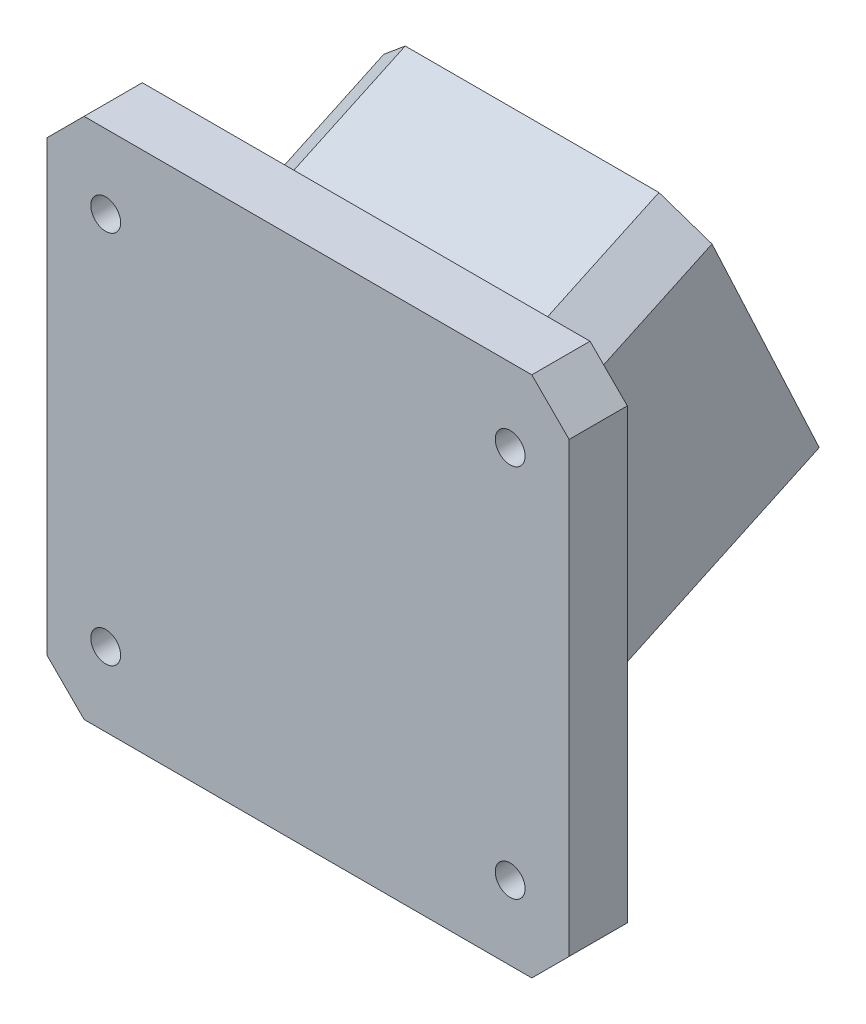
ISO-10303-21;
HEADER;
FILE_DESCRIPTION(('STEP AP214'),'2;1');
FILE_NAME('part.step','',(''),(''),'','','');
FILE_SCHEMA(('AUTOMOTIVE_DESIGN { 1 0 10303 214 1 1 1 1 }'));
ENDSEC;
DATA;
#1=APPLICATION_CONTEXT('core data for automotive mechanical design processes');
#2=APPLICATION_PROTOCOL_DEFINITION('international standard','automotive_design',2000,#1);
#3=PRODUCT_CONTEXT('',#1,'mechanical');
#4=PRODUCT('Part','Part','',(#3));
#5=PRODUCT_RELATED_PRODUCT_CATEGORY('part','',(#4));
#6=PRODUCT_DEFINITION_FORMATION('','',#4);
#7=PRODUCT_DEFINITION_CONTEXT('part definition',#1,'design');
#8=PRODUCT_DEFINITION('design','',#6,#7);
#9=PRODUCT_DEFINITION_SHAPE('','',#8);
#10=(LENGTH_UNIT() NAMED_UNIT(*) SI_UNIT(.MILLI.,.METRE.));
#11=(NAMED_UNIT(*) PLANE_ANGLE_UNIT() SI_UNIT($,.RADIAN.));
#12=(NAMED_UNIT(*) SI_UNIT($,.STERADIAN.) SOLID_ANGLE_UNIT());
#13=UNCERTAINTY_MEASURE_WITH_UNIT(LENGTH_MEASURE(1.E-05),#10,'distance_accuracy_value','');
#14=(GEOMETRIC_REPRESENTATION_CONTEXT(3) GLOBAL_UNCERTAINTY_ASSIGNED_CONTEXT((#13)) GLOBAL_UNIT_ASSIGNED_CONTEXT((#10,
#11,#12)) REPRESENTATION_CONTEXT('',''));
#15=CARTESIAN_POINT('',(0.,0.,0.));
#16=DIRECTION('',(0.,0.,1.));
#17=DIRECTION('',(1.,0.,0.));
#18=AXIS2_PLACEMENT_3D('',#15,#16,#17);
#19=CARTESIAN_POINT('',(0.,0.,3.9));
#20=DIRECTION('',(0.,0.,-1.));
#21=DIRECTION('',(-1.,0.,0.));
#22=AXIS2_PLACEMENT_3D('',#19,#20,#21);
#23=PLANE('',#22);
#24=DIRECTION('',(-1.,0.,0.));
#25=VECTOR('',#24,1.);
#26=CARTESIAN_POINT('',(15.,17.5,3.9));
#27=LINE('',#26,#25);
#28=CARTESIAN_POINT('',(15.,17.5,3.9));
#29=VERTEX_POINT('',#28);
#30=CARTESIAN_POINT('',(-15.,17.5,3.9));
#31=VERTEX_POINT('',#30);
#32=EDGE_CURVE('E177',#29,#31,#27,.T.);
#33=ORIENTED_EDGE('',*,*,#32,.T.);
#34=DIRECTION('',(-0.707106781186548,-0.707106781186548,0.));
#35=VECTOR('',#34,1.);
#36=CARTESIAN_POINT('',(-15.,17.5,3.9));
#37=LINE('',#36,#35);
#38=CARTESIAN_POINT('',(-17.5,15.,3.9));
#39=VERTEX_POINT('',#38);
#40=EDGE_CURVE('E106',#31,#39,#37,.T.);
#41=ORIENTED_EDGE('',*,*,#40,.T.);
#42=DIRECTION('',(0.,-1.,0.));
#43=VECTOR('',#42,1.);
#44=CARTESIAN_POINT('',(-17.5,-15.,3.9));
#45=LINE('',#44,#43);
#46=CARTESIAN_POINT('',(-17.5,-15.,3.9));
#47=VERTEX_POINT('',#46);
#48=EDGE_CURVE('E299',#39,#47,#45,.T.);
#49=ORIENTED_EDGE('',*,*,#48,.T.);
#50=DIRECTION('',(0.707106781186548,-0.707106781186548,0.));
#51=VECTOR('',#50,1.);
#52=CARTESIAN_POINT('',(-15.,-17.5,3.9));
#53=LINE('',#52,#51);
#54=CARTESIAN_POINT('',(-15.,-17.5,3.9));
#55=VERTEX_POINT('',#54);
#56=EDGE_CURVE('E302',#47,#55,#53,.T.);
#57=ORIENTED_EDGE('',*,*,#56,.T.);
#58=DIRECTION('',(1.,0.,0.));
#59=VECTOR('',#58,1.);
#60=CARTESIAN_POINT('',(15.,-17.5,3.9));
#61=LINE('',#60,#59);
#62=CARTESIAN_POINT('',(15.,-17.5,3.9));
#63=VERTEX_POINT('',#62);
#64=EDGE_CURVE('E128',#55,#63,#61,.T.);
#65=ORIENTED_EDGE('',*,*,#64,.T.);
#66=DIRECTION('',(0.707106781186548,0.707106781186548,0.));
#67=VECTOR('',#66,1.);
#68=CARTESIAN_POINT('',(15.,-17.5,3.9));
#69=LINE('',#68,#67);
#70=CARTESIAN_POINT('',(17.5,-15.,3.9));
#71=VERTEX_POINT('',#70);
#72=EDGE_CURVE('E121',#63,#71,#69,.T.);
#73=ORIENTED_EDGE('',*,*,#72,.T.);
#74=DIRECTION('',(0.,1.,0.));
#75=VECTOR('',#74,1.);
#76=CARTESIAN_POINT('',(17.5,-15.,3.9));
#77=LINE('',#76,#75);
#78=CARTESIAN_POINT('',(17.5,15.,3.9));
#79=VERTEX_POINT('',#78);
#80=EDGE_CURVE('E125',#71,#79,#77,.T.);
#81=ORIENTED_EDGE('',*,*,#80,.T.);
#82=DIRECTION('',(-0.707106781186548,0.707106781186548,0.));
#83=VECTOR('',#82,1.);
#84=CARTESIAN_POINT('',(17.5,15.,3.9));
#85=LINE('',#84,#83);
#86=EDGE_CURVE('E64',#79,#29,#85,.T.);
#87=ORIENTED_EDGE('',*,*,#86,.T.);
#88=EDGE_LOOP('',(#33,#41,#49,#57,#65,#73,#81,#87));
#89=FACE_BOUND('',#88,.T.);
#90=CARTESIAN_POINT('',(-13.55,12.55,3.9));
#91=DIRECTION('',(0.,0.,-1.));
#92=DIRECTION('',(-1.,0.,0.));
#93=AXIS2_PLACEMENT_3D('',#90,#91,#92);
#94=CIRCLE('',#93,1.);
#95=CARTESIAN_POINT('',(-14.55,12.55,3.9));
#96=VERTEX_POINT('',#95);
#97=EDGE_CURVE('E280',#96,#96,#94,.T.);
#98=ORIENTED_EDGE('',*,*,#97,.T.);
#99=EDGE_LOOP('',(#98));
#100=FACE_BOUND('',#99,.T.);
#101=CARTESIAN_POINT('',(13.55,-12.55,3.9));
#102=DIRECTION('',(0.,0.,-1.));
#103=DIRECTION('',(-1.,0.,0.));
#104=AXIS2_PLACEMENT_3D('',#101,#102,#103);
#105=CIRCLE('',#104,1.);
#106=CARTESIAN_POINT('',(12.55,-12.55,3.9));
#107=VERTEX_POINT('',#106);
#108=EDGE_CURVE('E284',#107,#107,#105,.T.);
#109=ORIENTED_EDGE('',*,*,#108,.T.);
#110=EDGE_LOOP('',(#109));
#111=FACE_BOUND('',#110,.T.);
#112=CARTESIAN_POINT('',(13.55,12.55,3.9));
#113=DIRECTION('',(0.,0.,-1.));
#114=DIRECTION('',(-1.,0.,0.));
#115=AXIS2_PLACEMENT_3D('',#112,#113,#114);
#116=CIRCLE('',#115,1.);
#117=CARTESIAN_POINT('',(12.55,12.55,3.9));
#118=VERTEX_POINT('',#117);
#119=EDGE_CURVE('E288',#118,#118,#116,.T.);
#120=ORIENTED_EDGE('',*,*,#119,.T.);
#121=EDGE_LOOP('',(#120));
#122=FACE_BOUND('',#121,.T.);
#123=CARTESIAN_POINT('',(-13.55,-12.55,3.9));
#124=DIRECTION('',(0.,0.,-1.));
#125=DIRECTION('',(-1.,0.,0.));
#126=AXIS2_PLACEMENT_3D('',#123,#124,#125);
#127=CIRCLE('',#126,1.);
#128=CARTESIAN_POINT('',(-14.55,-12.55,3.9));
#129=VERTEX_POINT('',#128);
#130=EDGE_CURVE('E158',#129,#129,#127,.T.);
#131=ORIENTED_EDGE('',*,*,#130,.T.);
#132=EDGE_LOOP('',(#131));
#133=FACE_BOUND('',#132,.T.);
#134=ADVANCED_FACE('F39',(#89,#100,#111,#122,#133),#23,.F.);
#135=CARTESIAN_POINT('',(15.,17.5,3.9));
#136=DIRECTION('',(0.,-1.,0.));
#137=DIRECTION('',(1.,0.,0.));
#138=AXIS2_PLACEMENT_3D('',#135,#136,#137);
#139=PLANE('',#138);
#140=DIRECTION('',(-1.,0.,0.));
#141=VECTOR('',#140,1.);
#142=CARTESIAN_POINT('',(15.,17.5,0.));
#143=LINE('',#142,#141);
#144=CARTESIAN_POINT('',(15.,17.5,0.));
#145=VERTEX_POINT('',#144);
#146=CARTESIAN_POINT('',(-15.,17.5,0.));
#147=VERTEX_POINT('',#146);
#148=EDGE_CURVE('E153',#145,#147,#143,.T.);
#149=ORIENTED_EDGE('',*,*,#148,.T.);
#150=DIRECTION('',(0.,0.,-1.));
#151=VECTOR('',#150,1.);
#152=CARTESIAN_POINT('',(-15.,17.5,3.9));
#153=LINE('',#152,#151);
#154=EDGE_CURVE('E196',#31,#147,#153,.T.);
#155=ORIENTED_EDGE('',*,*,#154,.F.);
#156=ORIENTED_EDGE('',*,*,#32,.F.);
#157=DIRECTION('',(0.,0.,-1.));
#158=VECTOR('',#157,1.);
#159=CARTESIAN_POINT('',(15.,17.5,3.9));
#160=LINE('',#159,#158);
#161=EDGE_CURVE('E149',#29,#145,#160,.T.);
#162=ORIENTED_EDGE('',*,*,#161,.T.);
#163=EDGE_LOOP('',(#149,#155,#156,#162));
#164=FACE_BOUND('',#163,.T.);
#165=ADVANCED_FACE('F41',(#164),#139,.F.);
#166=CARTESIAN_POINT('',(-15.,17.5,3.9));
#167=DIRECTION('',(0.707106781186547,-0.707106781186547,0.));
#168=DIRECTION('',(0.707106781186548,0.707106781186548,0.));
#169=AXIS2_PLACEMENT_3D('',#166,#167,#168);
#170=PLANE('',#169);
#171=DIRECTION('',(-0.707106781186548,-0.707106781186548,0.));
#172=VECTOR('',#171,1.);
#173=CARTESIAN_POINT('',(-15.,17.5,0.));
#174=LINE('',#173,#172);
#175=CARTESIAN_POINT('',(-17.5,15.,0.));
#176=VERTEX_POINT('',#175);
#177=EDGE_CURVE('E157',#147,#176,#174,.T.);
#178=ORIENTED_EDGE('',*,*,#177,.T.);
#179=DIRECTION('',(0.,0.,-1.));
#180=VECTOR('',#179,1.);
#181=CARTESIAN_POINT('',(-17.5,15.,3.9));
#182=LINE('',#181,#180);
#183=EDGE_CURVE('E192',#39,#176,#182,.T.);
#184=ORIENTED_EDGE('',*,*,#183,.F.);
#185=ORIENTED_EDGE('',*,*,#40,.F.);
#186=ORIENTED_EDGE('',*,*,#154,.T.);
#187=EDGE_LOOP('',(#178,#184,#185,#186));
#188=FACE_BOUND('',#187,.T.);
#189=ADVANCED_FACE('F321',(#188),#170,.F.);
#190=CARTESIAN_POINT('',(-17.5,-15.,3.9));
#191=DIRECTION('',(1.,0.,0.));
#192=DIRECTION('',(0.,0.,-1.));
#193=AXIS2_PLACEMENT_3D('',#190,#191,#192);
#194=PLANE('',#193);
#195=DIRECTION('',(0.,-1.,0.));
#196=VECTOR('',#195,1.);
#197=CARTESIAN_POINT('',(-17.5,-15.,0.));
#198=LINE('',#197,#196);
#199=CARTESIAN_POINT('',(-17.5,-15.,0.));
#200=VERTEX_POINT('',#199);
#201=EDGE_CURVE('E161',#176,#200,#198,.T.);
#202=ORIENTED_EDGE('',*,*,#201,.T.);
#203=DIRECTION('',(0.,0.,-1.));
#204=VECTOR('',#203,1.);
#205=CARTESIAN_POINT('',(-17.5,-15.,3.9));
#206=LINE('',#205,#204);
#207=EDGE_CURVE('E188',#47,#200,#206,.T.);
#208=ORIENTED_EDGE('',*,*,#207,.F.);
#209=ORIENTED_EDGE('',*,*,#48,.F.);
#210=ORIENTED_EDGE('',*,*,#183,.T.);
#211=EDGE_LOOP('',(#202,#208,#209,#210));
#212=FACE_BOUND('',#211,.T.);
#213=ADVANCED_FACE('F324',(#212),#194,.F.);
#214=CARTESIAN_POINT('',(-15.,-17.5,3.9));
#215=DIRECTION('',(0.707106781186547,0.707106781186547,0.));
#216=DIRECTION('',(-0.707106781186548,0.707106781186548,0.));
#217=AXIS2_PLACEMENT_3D('',#214,#215,#216);
#218=PLANE('',#217);
#219=DIRECTION('',(0.707106781186548,-0.707106781186548,0.));
#220=VECTOR('',#219,1.);
#221=CARTESIAN_POINT('',(-15.,-17.5,0.));
#222=LINE('',#221,#220);
#223=CARTESIAN_POINT('',(-15.,-17.5,0.));
#224=VERTEX_POINT('',#223);
#225=EDGE_CURVE('E164',#200,#224,#222,.T.);
#226=ORIENTED_EDGE('',*,*,#225,.T.);
#227=DIRECTION('',(0.,0.,-1.));
#228=VECTOR('',#227,1.);
#229=CARTESIAN_POINT('',(-15.,-17.5,3.9));
#230=LINE('',#229,#228);
#231=EDGE_CURVE('E184',#55,#224,#230,.T.);
#232=ORIENTED_EDGE('',*,*,#231,.F.);
#233=ORIENTED_EDGE('',*,*,#56,.F.);
#234=ORIENTED_EDGE('',*,*,#207,.T.);
#235=EDGE_LOOP('',(#226,#232,#233,#234));
#236=FACE_BOUND('',#235,.T.);
#237=ADVANCED_FACE('F310',(#236),#218,.F.);
#238=CARTESIAN_POINT('',(15.,-17.5,3.9));
#239=DIRECTION('',(0.,1.,0.));
#240=DIRECTION('',(-1.,0.,0.));
#241=AXIS2_PLACEMENT_3D('',#238,#239,#240);
#242=PLANE('',#241);
#243=DIRECTION('',(1.,0.,0.));
#244=VECTOR('',#243,1.);
#245=CARTESIAN_POINT('',(15.,-17.5,0.));
#246=LINE('',#245,#244);
#247=CARTESIAN_POINT('',(15.,-17.5,0.));
#248=VERTEX_POINT('',#247);
#249=EDGE_CURVE('E167',#224,#248,#246,.T.);
#250=ORIENTED_EDGE('',*,*,#249,.T.);
#251=DIRECTION('',(0.,0.,-1.));
#252=VECTOR('',#251,1.);
#253=CARTESIAN_POINT('',(15.,-17.5,3.9));
#254=LINE('',#253,#252);
#255=EDGE_CURVE('E142',#63,#248,#254,.T.);
#256=ORIENTED_EDGE('',*,*,#255,.F.);
#257=ORIENTED_EDGE('',*,*,#64,.F.);
#258=ORIENTED_EDGE('',*,*,#231,.T.);
#259=EDGE_LOOP('',(#250,#256,#257,#258));
#260=FACE_BOUND('',#259,.T.);
#261=ADVANCED_FACE('F314',(#260),#242,.F.);
#262=CARTESIAN_POINT('',(15.,-17.5,3.9));
#263=DIRECTION('',(-0.707106781186547,0.707106781186547,0.));
#264=DIRECTION('',(-0.707106781186548,-0.707106781186548,0.));
#265=AXIS2_PLACEMENT_3D('',#262,#263,#264);
#266=PLANE('',#265);
#267=DIRECTION('',(0.707106781186548,0.707106781186548,0.));
#268=VECTOR('',#267,1.);
#269=CARTESIAN_POINT('',(15.,-17.5,0.));
#270=LINE('',#269,#268);
#271=CARTESIAN_POINT('',(17.5,-15.,0.));
#272=VERTEX_POINT('',#271);
#273=EDGE_CURVE('E138',#248,#272,#270,.T.);
#274=ORIENTED_EDGE('',*,*,#273,.T.);
#275=DIRECTION('',(0.,0.,-1.));
#276=VECTOR('',#275,1.);
#277=CARTESIAN_POINT('',(17.5,-15.,3.9));
#278=LINE('',#277,#276);
#279=EDGE_CURVE('E135',#71,#272,#278,.T.);
#280=ORIENTED_EDGE('',*,*,#279,.F.);
#281=ORIENTED_EDGE('',*,*,#72,.F.);
#282=ORIENTED_EDGE('',*,*,#255,.T.);
#283=EDGE_LOOP('',(#274,#280,#281,#282));
#284=FACE_BOUND('',#283,.T.);
#285=ADVANCED_FACE('F136',(#284),#266,.F.);
#286=CARTESIAN_POINT('',(17.5,-15.,3.9));
#287=DIRECTION('',(-1.,0.,0.));
#288=DIRECTION('',(0.,0.,1.));
#289=AXIS2_PLACEMENT_3D('',#286,#287,#288);
#290=PLANE('',#289);
#291=DIRECTION('',(0.,1.,0.));
#292=VECTOR('',#291,1.);
#293=CARTESIAN_POINT('',(17.5,-15.,0.));
#294=LINE('',#293,#292);
#295=CARTESIAN_POINT('',(17.5,15.,0.));
#296=VERTEX_POINT('',#295);
#297=EDGE_CURVE('E172',#272,#296,#294,.T.);
#298=ORIENTED_EDGE('',*,*,#297,.T.);
#299=DIRECTION('',(0.,0.,-1.));
#300=VECTOR('',#299,1.);
#301=CARTESIAN_POINT('',(17.5,15.,3.9));
#302=LINE('',#301,#300);
#303=EDGE_CURVE('E143',#79,#296,#302,.T.);
#304=ORIENTED_EDGE('',*,*,#303,.F.);
#305=ORIENTED_EDGE('',*,*,#80,.F.);
#306=ORIENTED_EDGE('',*,*,#279,.T.);
#307=EDGE_LOOP('',(#298,#304,#305,#306));
#308=FACE_BOUND('',#307,.T.);
#309=ADVANCED_FACE('F145',(#308),#290,.F.);
#310=CARTESIAN_POINT('',(17.5,15.,3.9));
#311=DIRECTION('',(-0.707106781186547,-0.707106781186547,0.));
#312=DIRECTION('',(0.707106781186548,-0.707106781186548,0.));
#313=AXIS2_PLACEMENT_3D('',#310,#311,#312);
#314=PLANE('',#313);
#315=DIRECTION('',(-0.707106781186548,0.707106781186548,0.));
#316=VECTOR('',#315,1.);
#317=CARTESIAN_POINT('',(17.5,15.,0.));
#318=LINE('',#317,#316);
#319=EDGE_CURVE('E97',#296,#145,#318,.T.);
#320=ORIENTED_EDGE('',*,*,#319,.T.);
#321=ORIENTED_EDGE('',*,*,#161,.F.);
#322=ORIENTED_EDGE('',*,*,#86,.F.);
#323=ORIENTED_EDGE('',*,*,#303,.T.);
#324=EDGE_LOOP('',(#320,#321,#322,#323));
#325=FACE_BOUND('',#324,.T.);
#326=ADVANCED_FACE('F317',(#325),#314,.F.);
#327=CARTESIAN_POINT('',(0.,0.,0.));
#328=DIRECTION('',(0.,0.,-1.));
#329=DIRECTION('',(-1.,0.,0.));
#330=AXIS2_PLACEMENT_3D('',#327,#328,#329);
#331=PLANE('',#330);
#332=DIRECTION('',(-0.67154293423782,0.740965645273288,0.));
#333=VECTOR('',#332,1.);
#334=CARTESIAN_POINT('',(10.7060867057676,9.70300975012673,0.));
#335=LINE('',#334,#333);
#336=CARTESIAN_POINT('',(11.,9.37871231118112,0.));
#337=VERTEX_POINT('',#336);
#338=CARTESIAN_POINT('',(8.49999999999999,12.1371571085873,0.));
#339=VERTEX_POINT('',#338);
#340=EDGE_CURVE('E48',#337,#339,#335,.T.);
#341=ORIENTED_EDGE('',*,*,#340,.T.);
#342=DIRECTION('',(-1.,0.,0.));
#343=VECTOR('',#342,1.);
#344=CARTESIAN_POINT('',(0.,12.1371571085873,0.));
#345=LINE('',#344,#343);
#346=CARTESIAN_POINT('',(-8.5,12.1371571085873,0.));
#347=VERTEX_POINT('',#346);
#348=EDGE_CURVE('E11',#339,#347,#345,.T.);
#349=ORIENTED_EDGE('',*,*,#348,.T.);
#350=DIRECTION('',(-0.67154293423782,-0.740965645273287,0.));
#351=VECTOR('',#350,1.);
#352=CARTESIAN_POINT('',(-10.7060867057675,9.70300975012674,0.));
#353=LINE('',#352,#351);
#354=CARTESIAN_POINT('',(-11.,9.37871231118113,0.));
#355=VERTEX_POINT('',#354);
#356=EDGE_CURVE('E203',#347,#355,#353,.T.);
#357=ORIENTED_EDGE('',*,*,#356,.T.);
#358=DIRECTION('',(0.,-1.,0.));
#359=VECTOR('',#358,1.);
#360=CARTESIAN_POINT('',(-11.,0.,0.));
#361=LINE('',#360,#359);
#362=CARTESIAN_POINT('',(-11.,-9.37871231118112,0.));
#363=VERTEX_POINT('',#362);
#364=EDGE_CURVE('E207',#355,#363,#361,.T.);
#365=ORIENTED_EDGE('',*,*,#364,.T.);
#366=DIRECTION('',(0.67154293423782,-0.740965645273287,0.));
#367=VECTOR('',#366,1.);
#368=CARTESIAN_POINT('',(-10.7060867057675,-9.70300975012673,0.));
#369=LINE('',#368,#367);
#370=CARTESIAN_POINT('',(-8.49999999999999,-12.1371571085873,0.));
#371=VERTEX_POINT('',#370);
#372=EDGE_CURVE('E211',#363,#371,#369,.T.);
#373=ORIENTED_EDGE('',*,*,#372,.T.);
#374=DIRECTION('',(1.,0.,0.));
#375=VECTOR('',#374,1.);
#376=CARTESIAN_POINT('',(0.,-12.1371571085873,0.));
#377=LINE('',#376,#375);
#378=CARTESIAN_POINT('',(8.5,-12.1371571085873,0.));
#379=VERTEX_POINT('',#378);
#380=EDGE_CURVE('E215',#371,#379,#377,.T.);
#381=ORIENTED_EDGE('',*,*,#380,.T.);
#382=DIRECTION('',(0.67154293423782,0.740965645273287,0.));
#383=VECTOR('',#382,1.);
#384=CARTESIAN_POINT('',(10.7060867057675,-9.70300975012674,0.));
#385=LINE('',#384,#383);
#386=CARTESIAN_POINT('',(11.,-9.37871231118113,0.));
#387=VERTEX_POINT('',#386);
#388=EDGE_CURVE('E219',#379,#387,#385,.T.);
#389=ORIENTED_EDGE('',*,*,#388,.T.);
#390=DIRECTION('',(0.,1.,0.));
#391=VECTOR('',#390,1.);
#392=CARTESIAN_POINT('',(11.,0.,0.));
#393=LINE('',#392,#391);
#394=EDGE_CURVE('E223',#387,#337,#393,.T.);
#395=ORIENTED_EDGE('',*,*,#394,.T.);
#396=EDGE_LOOP('',(#341,#349,#357,#365,#373,#381,#389,#395));
#397=FACE_BOUND('',#396,.T.);
#398=CARTESIAN_POINT('',(-13.55,-12.55,0.));
#399=DIRECTION('',(0.,0.,1.));
#400=DIRECTION('',(1.,0.,0.));
#401=AXIS2_PLACEMENT_3D('',#398,#399,#400);
#402=CIRCLE('',#401,1.);
#403=CARTESIAN_POINT('',(-12.55,-12.55,0.));
#404=VERTEX_POINT('',#403);
#405=EDGE_CURVE('E269',#404,#404,#402,.T.);
#406=ORIENTED_EDGE('',*,*,#405,.T.);
#407=EDGE_LOOP('',(#406));
#408=FACE_BOUND('',#407,.T.);
#409=CARTESIAN_POINT('',(13.55,12.55,0.));
#410=DIRECTION('',(0.,0.,1.));
#411=DIRECTION('',(1.,0.,0.));
#412=AXIS2_PLACEMENT_3D('',#409,#410,#411);
#413=CIRCLE('',#412,1.);
#414=CARTESIAN_POINT('',(14.55,12.55,0.));
#415=VERTEX_POINT('',#414);
#416=EDGE_CURVE('E268',#415,#415,#413,.T.);
#417=ORIENTED_EDGE('',*,*,#416,.T.);
#418=EDGE_LOOP('',(#417));
#419=FACE_BOUND('',#418,.T.);
#420=CARTESIAN_POINT('',(13.55,-12.55,0.));
#421=DIRECTION('',(0.,0.,1.));
#422=DIRECTION('',(1.,0.,0.));
#423=AXIS2_PLACEMENT_3D('',#420,#421,#422);
#424=CIRCLE('',#423,1.);
#425=CARTESIAN_POINT('',(14.55,-12.55,0.));
#426=VERTEX_POINT('',#425);
#427=EDGE_CURVE('E259',#426,#426,#424,.T.);
#428=ORIENTED_EDGE('',*,*,#427,.T.);
#429=EDGE_LOOP('',(#428));
#430=FACE_BOUND('',#429,.T.);
#431=CARTESIAN_POINT('',(-13.55,12.55,0.));
#432=DIRECTION('',(0.,0.,1.));
#433=DIRECTION('',(1.,0.,0.));
#434=AXIS2_PLACEMENT_3D('',#431,#432,#433);
#435=CIRCLE('',#434,1.);
#436=CARTESIAN_POINT('',(-12.55,12.55,0.));
#437=VERTEX_POINT('',#436);
#438=EDGE_CURVE('E273',#437,#437,#435,.T.);
#439=ORIENTED_EDGE('',*,*,#438,.T.);
#440=EDGE_LOOP('',(#439));
#441=FACE_BOUND('',#440,.T.);
#442=ORIENTED_EDGE('',*,*,#148,.F.);
#443=ORIENTED_EDGE('',*,*,#319,.F.);
#444=ORIENTED_EDGE('',*,*,#297,.F.);
#445=ORIENTED_EDGE('',*,*,#273,.F.);
#446=ORIENTED_EDGE('',*,*,#249,.F.);
#447=ORIENTED_EDGE('',*,*,#225,.F.);
#448=ORIENTED_EDGE('',*,*,#201,.F.);
#449=ORIENTED_EDGE('',*,*,#177,.F.);
#450=EDGE_LOOP('',(#442,#443,#444,#445,#446,#447,#448,#449));
#451=FACE_BOUND('',#450,.T.);
#452=ADVANCED_FACE('F230',(#397,#408,#419,#430,#441,#451),#331,.T.);
#453=CARTESIAN_POINT('',(-13.55,12.55,0.));
#454=DIRECTION('',(0.,0.,1.));
#455=DIRECTION('',(1.,0.,0.));
#456=AXIS2_PLACEMENT_3D('',#453,#454,#455);
#457=CYLINDRICAL_SURFACE('',#456,1.);
#458=ORIENTED_EDGE('',*,*,#438,.F.);
#459=EDGE_LOOP('',(#458));
#460=FACE_BOUND('',#459,.T.);
#461=ORIENTED_EDGE('',*,*,#97,.F.);
#462=EDGE_LOOP('',(#461));
#463=FACE_BOUND('',#462,.T.);
#464=ADVANCED_FACE('F339',(#460,#463),#457,.F.);
#465=CARTESIAN_POINT('',(13.55,-12.55,0.));
#466=DIRECTION('',(0.,0.,1.));
#467=DIRECTION('',(1.,0.,0.));
#468=AXIS2_PLACEMENT_3D('',#465,#466,#467);
#469=CYLINDRICAL_SURFACE('',#468,1.);
#470=ORIENTED_EDGE('',*,*,#427,.F.);
#471=EDGE_LOOP('',(#470));
#472=FACE_BOUND('',#471,.T.);
#473=ORIENTED_EDGE('',*,*,#108,.F.);
#474=EDGE_LOOP('',(#473));
#475=FACE_BOUND('',#474,.T.);
#476=ADVANCED_FACE('F379',(#472,#475),#469,.F.);
#477=CARTESIAN_POINT('',(13.55,12.55,0.));
#478=DIRECTION('',(0.,0.,1.));
#479=DIRECTION('',(1.,0.,0.));
#480=AXIS2_PLACEMENT_3D('',#477,#478,#479);
#481=CYLINDRICAL_SURFACE('',#480,1.);
#482=ORIENTED_EDGE('',*,*,#416,.F.);
#483=EDGE_LOOP('',(#482));
#484=FACE_BOUND('',#483,.T.);
#485=ORIENTED_EDGE('',*,*,#119,.F.);
#486=EDGE_LOOP('',(#485));
#487=FACE_BOUND('',#486,.T.);
#488=ADVANCED_FACE('F386',(#484,#487),#481,.F.);
#489=CARTESIAN_POINT('',(-13.55,-12.55,0.));
#490=DIRECTION('',(0.,0.,1.));
#491=DIRECTION('',(1.,0.,0.));
#492=AXIS2_PLACEMENT_3D('',#489,#490,#491);
#493=CYLINDRICAL_SURFACE('',#492,1.);
#494=ORIENTED_EDGE('',*,*,#405,.F.);
#495=EDGE_LOOP('',(#494));
#496=FACE_BOUND('',#495,.T.);
#497=ORIENTED_EDGE('',*,*,#130,.F.);
#498=EDGE_LOOP('',(#497));
#499=FACE_BOUND('',#498,.T.);
#500=ADVANCED_FACE('F394',(#496,#499),#493,.F.);
#501=CARTESIAN_POINT('',(0.,7.35179103264949,-15.7659667476575));
#502=DIRECTION('',(0.,-0.422618261740688,0.906307787036655));
#503=DIRECTION('',(0.,-0.906307787036655,-0.422618261740688));
#504=AXIS2_PLACEMENT_3D('',#501,#502,#503);
#505=CYLINDRICAL_SURFACE('',#504,8.);
#506=CARTESIAN_POINT('',(0.,0.,0.));
#507=DIRECTION('',(0.,0.,-1.));
#508=DIRECTION('',(0.,-1.,0.));
#509=AXIS2_PLACEMENT_3D('',#506,#507,#508);
#510=ELLIPSE('',#509,8.82702335169988,8.);
#511=CARTESIAN_POINT('',(0.,-8.82702335169988,0.));
#512=VERTEX_POINT('',#511);
#513=EDGE_CURVE('E199',#512,#512,#510,.F.);
#514=ORIENTED_EDGE('',*,*,#513,.T.);
#515=EDGE_LOOP('',(#514));
#516=FACE_BOUND('',#515,.T.);
#517=CARTESIAN_POINT('',(0.,7.35179103264949,-15.7659667476575));
#518=DIRECTION('',(0.,0.422618261740688,-0.906307787036655));
#519=DIRECTION('',(0.,0.906307787036655,0.422618261740688));
#520=AXIS2_PLACEMENT_3D('',#517,#518,#519);
#521=CIRCLE('',#520,8.);
#522=CARTESIAN_POINT('',(0.,14.6022533289427,-12.385020653732));
#523=VERTEX_POINT('',#522);
#524=EDGE_CURVE('E554',#523,#523,#521,.T.);
#525=ORIENTED_EDGE('',*,*,#524,.T.);
#526=EDGE_LOOP('',(#525));
#527=FACE_BOUND('',#526,.T.);
#528=ADVANCED_FACE('F400',(#516,#527),#505,.F.);
#529=CARTESIAN_POINT('',(-11.,15.0554072224611,-12.1737115228616));
#530=DIRECTION('',(0.707106781186547,-0.640856382055793,-0.298836238730112));
#531=DIRECTION('',(0.67154293423782,0.740965645273287,0.));
#532=AXIS2_PLACEMENT_3D('',#529,#530,#531);
#533=PLANE('',#532);
#534=ORIENTED_EDGE('',*,*,#356,.F.);
#535=DIRECTION('',(0.,-0.422618261740688,0.906307787036655));
#536=VECTOR('',#535,1.);
#537=CARTESIAN_POINT('',(-8.5,17.3211766900527,-11.1171658685099));
#538=LINE('',#537,#536);
#539=CARTESIAN_POINT('',(-8.5,17.3211766900527,-11.1171658685099));
#540=VERTEX_POINT('',#539);
#541=EDGE_CURVE('E589',#540,#347,#538,.T.);
#542=ORIENTED_EDGE('',*,*,#541,.F.);
#543=DIRECTION('',(0.707106781186548,0.640856382055792,0.298836238730112));
#544=VECTOR('',#543,1.);
#545=CARTESIAN_POINT('',(-11.,15.0554072224611,-12.1737115228616));
#546=LINE('',#545,#544);
#547=CARTESIAN_POINT('',(-11.,15.0554072224611,-12.1737115228616));
#548=VERTEX_POINT('',#547);
#549=EDGE_CURVE('E585',#548,#540,#546,.T.);
#550=ORIENTED_EDGE('',*,*,#549,.F.);
#551=DIRECTION('',(0.,-0.422618261740688,0.906307787036655));
#552=VECTOR('',#551,1.);
#553=CARTESIAN_POINT('',(-11.,15.0554072224611,-12.1737115228616));
#554=LINE('',#553,#552);
#555=EDGE_CURVE('E55',#548,#355,#554,.T.);
#556=ORIENTED_EDGE('',*,*,#555,.T.);
#557=EDGE_LOOP('',(#534,#542,#550,#556));
#558=FACE_BOUND('',#557,.T.);
#559=ADVANCED_FACE('F407',(#558),#533,.F.);
#560=CARTESIAN_POINT('',(-11.,-0.35182515716208,-19.3582219724533));
#561=DIRECTION('',(1.,0.,0.));
#562=DIRECTION('',(0.,1.,0.));
#563=AXIS2_PLACEMENT_3D('',#560,#561,#562);
#564=PLANE('',#563);
#565=ORIENTED_EDGE('',*,*,#364,.F.);
#566=ORIENTED_EDGE('',*,*,#555,.F.);
#567=DIRECTION('',(0.,0.906307787036655,0.422618261740688));
#568=VECTOR('',#567,1.);
#569=CARTESIAN_POINT('',(-11.,-0.35182515716208,-19.3582219724533));
#570=LINE('',#569,#568);
#571=CARTESIAN_POINT('',(-11.,-0.35182515716208,-19.3582219724533));
#572=VERTEX_POINT('',#571);
#573=EDGE_CURVE('E581',#572,#548,#570,.T.);
#574=ORIENTED_EDGE('',*,*,#573,.F.);
#575=DIRECTION('',(0.,-0.422618261740688,0.906307787036655));
#576=VECTOR('',#575,1.);
#577=CARTESIAN_POINT('',(-11.,-0.35182515716208,-19.3582219724533));
#578=LINE('',#577,#576);
#579=EDGE_CURVE('E595',#572,#363,#578,.T.);
#580=ORIENTED_EDGE('',*,*,#579,.T.);
#581=EDGE_LOOP('',(#565,#566,#574,#580));
#582=FACE_BOUND('',#581,.T.);
#583=ADVANCED_FACE('F415',(#582),#564,.F.);
#584=CARTESIAN_POINT('',(-8.49999999999999,-2.61759462475372,-20.414767626805));
#585=DIRECTION('',(0.707106781186548,0.640856382055792,0.298836238730112));
#586=DIRECTION('',(-0.67154293423782,0.740965645273287,0.));
#587=AXIS2_PLACEMENT_3D('',#584,#585,#586);
#588=PLANE('',#587);
#589=ORIENTED_EDGE('',*,*,#372,.F.);
#590=ORIENTED_EDGE('',*,*,#579,.F.);
#591=DIRECTION('',(-0.707106781186547,0.640856382055793,0.298836238730112));
#592=VECTOR('',#591,1.);
#593=CARTESIAN_POINT('',(-8.49999999999999,-2.61759462475372,-20.414767626805));
#594=LINE('',#593,#592);
#595=CARTESIAN_POINT('',(-8.49999999999999,-2.61759462475372,-20.414767626805));
#596=VERTEX_POINT('',#595);
#597=EDGE_CURVE('E577',#596,#572,#594,.T.);
#598=ORIENTED_EDGE('',*,*,#597,.F.);
#599=DIRECTION('',(0.,-0.422618261740688,0.906307787036655));
#600=VECTOR('',#599,1.);
#601=CARTESIAN_POINT('',(-8.49999999999999,-2.61759462475372,-20.414767626805));
#602=LINE('',#601,#600);
#603=EDGE_CURVE('E599',#596,#371,#602,.T.);
#604=ORIENTED_EDGE('',*,*,#603,.T.);
#605=EDGE_LOOP('',(#589,#590,#598,#604));
#606=FACE_BOUND('',#605,.T.);
#607=ADVANCED_FACE('F422',(#606),#588,.F.);
#608=CARTESIAN_POINT('',(-8.49999999999999,-2.61759462475372,-20.414767626805));
#609=DIRECTION('',(0.,0.906307787036655,0.422618261740688));
#610=DIRECTION('',(0.,-0.422618261740688,0.906307787036655));
#611=AXIS2_PLACEMENT_3D('',#608,#609,#610);
#612=PLANE('',#611);
#613=ORIENTED_EDGE('',*,*,#380,.F.);
#614=ORIENTED_EDGE('',*,*,#603,.F.);
#615=DIRECTION('',(-1.,0.,0.));
#616=VECTOR('',#615,1.);
#617=CARTESIAN_POINT('',(-8.49999999999999,-2.61759462475372,-20.414767626805));
#618=LINE('',#617,#616);
#619=CARTESIAN_POINT('',(8.5,-2.61759462475372,-20.414767626805));
#620=VERTEX_POINT('',#619);
#621=EDGE_CURVE('E573',#620,#596,#618,.T.);
#622=ORIENTED_EDGE('',*,*,#621,.F.);
#623=DIRECTION('',(0.,-0.422618261740688,0.906307787036655));
#624=VECTOR('',#623,1.);
#625=CARTESIAN_POINT('',(8.5,-2.61759462475372,-20.414767626805));
#626=LINE('',#625,#624);
#627=EDGE_CURVE('E261',#620,#379,#626,.T.);
#628=ORIENTED_EDGE('',*,*,#627,.T.);
#629=EDGE_LOOP('',(#613,#614,#622,#628));
#630=FACE_BOUND('',#629,.T.);
#631=ADVANCED_FACE('F430',(#630),#612,.F.);
#632=CARTESIAN_POINT('',(8.5,-2.61759462475372,-20.414767626805));
#633=DIRECTION('',(-0.707106781186547,0.640856382055793,0.298836238730112));
#634=DIRECTION('',(-0.67154293423782,-0.740965645273287,0.));
#635=AXIS2_PLACEMENT_3D('',#632,#633,#634);
#636=PLANE('',#635);
#637=ORIENTED_EDGE('',*,*,#388,.F.);
#638=ORIENTED_EDGE('',*,*,#627,.F.);
#639=DIRECTION('',(-0.707106781186548,-0.640856382055792,-0.298836238730112));
#640=VECTOR('',#639,1.);
#641=CARTESIAN_POINT('',(8.5,-2.61759462475372,-20.414767626805));
#642=LINE('',#641,#640);
#643=CARTESIAN_POINT('',(11.,-0.351825157162081,-19.3582219724533));
#644=VERTEX_POINT('',#643);
#645=EDGE_CURVE('E569',#644,#620,#642,.T.);
#646=ORIENTED_EDGE('',*,*,#645,.F.);
#647=DIRECTION('',(0.,-0.422618261740688,0.906307787036655));
#648=VECTOR('',#647,1.);
#649=CARTESIAN_POINT('',(11.,-0.351825157162081,-19.3582219724533));
#650=LINE('',#649,#648);
#651=EDGE_CURVE('E255',#644,#387,#650,.T.);
#652=ORIENTED_EDGE('',*,*,#651,.T.);
#653=EDGE_LOOP('',(#637,#638,#646,#652));
#654=FACE_BOUND('',#653,.T.);
#655=ADVANCED_FACE('F438',(#654),#636,.F.);
#656=CARTESIAN_POINT('',(11.,-0.351825157162081,-19.3582219724533));
#657=DIRECTION('',(-1.,0.,0.));
#658=DIRECTION('',(0.,-1.,0.));
#659=AXIS2_PLACEMENT_3D('',#656,#657,#658);
#660=PLANE('',#659);
#661=ORIENTED_EDGE('',*,*,#394,.F.);
#662=ORIENTED_EDGE('',*,*,#651,.F.);
#663=DIRECTION('',(0.,-0.906307787036655,-0.422618261740688));
#664=VECTOR('',#663,1.);
#665=CARTESIAN_POINT('',(11.,-0.351825157162081,-19.3582219724533));
#666=LINE('',#665,#664);
#667=CARTESIAN_POINT('',(11.,15.0554072224611,-12.1737115228616));
#668=VERTEX_POINT('',#667);
#669=EDGE_CURVE('E253',#668,#644,#666,.T.);
#670=ORIENTED_EDGE('',*,*,#669,.F.);
#671=DIRECTION('',(0.,-0.422618261740688,0.906307787036655));
#672=VECTOR('',#671,1.);
#673=CARTESIAN_POINT('',(11.,15.0554072224611,-12.1737115228616));
#674=LINE('',#673,#672);
#675=EDGE_CURVE('E243',#668,#337,#674,.T.);
#676=ORIENTED_EDGE('',*,*,#675,.T.);
#677=EDGE_LOOP('',(#661,#662,#670,#676));
#678=FACE_BOUND('',#677,.T.);
#679=ADVANCED_FACE('F249',(#678),#660,.F.);
#680=CARTESIAN_POINT('',(8.49999999999999,17.3211766900527,-11.1171658685099));
#681=DIRECTION('',(-0.707106781186548,-0.640856382055792,-0.298836238730112));
#682=DIRECTION('',(0.67154293423782,-0.740965645273288,0.));
#683=AXIS2_PLACEMENT_3D('',#680,#681,#682);
#684=PLANE('',#683);
#685=ORIENTED_EDGE('',*,*,#340,.F.);
#686=ORIENTED_EDGE('',*,*,#675,.F.);
#687=DIRECTION('',(0.707106781186547,-0.640856382055793,-0.298836238730112));
#688=VECTOR('',#687,1.);
#689=CARTESIAN_POINT('',(8.49999999999999,17.3211766900527,-11.1171658685099));
#690=LINE('',#689,#688);
#691=CARTESIAN_POINT('',(8.49999999999999,17.3211766900527,-11.1171658685099));
#692=VERTEX_POINT('',#691);
#693=EDGE_CURVE('E561',#692,#668,#690,.T.);
#694=ORIENTED_EDGE('',*,*,#693,.F.);
#695=DIRECTION('',(0.,-0.422618261740688,0.906307787036655));
#696=VECTOR('',#695,1.);
#697=CARTESIAN_POINT('',(8.49999999999999,17.3211766900527,-11.1171658685099));
#698=LINE('',#697,#696);
#699=EDGE_CURVE('E246',#692,#339,#698,.T.);
#700=ORIENTED_EDGE('',*,*,#699,.T.);
#701=EDGE_LOOP('',(#685,#686,#694,#700));
#702=FACE_BOUND('',#701,.T.);
#703=ADVANCED_FACE('F240',(#702),#684,.F.);
#704=CARTESIAN_POINT('',(-8.5,17.3211766900527,-11.1171658685099));
#705=DIRECTION('',(0.,-0.906307787036655,-0.422618261740688));
#706=DIRECTION('',(0.,0.422618261740688,-0.906307787036655));
#707=AXIS2_PLACEMENT_3D('',#704,#705,#706);
#708=PLANE('',#707);
#709=ORIENTED_EDGE('',*,*,#348,.F.);
#710=ORIENTED_EDGE('',*,*,#699,.F.);
#711=DIRECTION('',(1.,0.,0.));
#712=VECTOR('',#711,1.);
#713=CARTESIAN_POINT('',(-8.5,17.3211766900527,-11.1171658685099));
#714=LINE('',#713,#712);
#715=EDGE_CURVE('E557',#540,#692,#714,.T.);
#716=ORIENTED_EDGE('',*,*,#715,.F.);
#717=ORIENTED_EDGE('',*,*,#541,.T.);
#718=EDGE_LOOP('',(#709,#710,#716,#717));
#719=FACE_BOUND('',#718,.T.);
#720=ADVANCED_FACE('F459',(#719),#708,.F.);
#721=CARTESIAN_POINT('',(0.,7.35179103264949,-15.7659667476575));
#722=DIRECTION('',(0.,-0.422618261740688,0.906307787036655));
#723=DIRECTION('',(0.,-0.906307787036655,-0.422618261740688));
#724=AXIS2_PLACEMENT_3D('',#721,#722,#723);
#725=PLANE('',#724);
#726=ORIENTED_EDGE('',*,*,#715,.T.);
#727=ORIENTED_EDGE('',*,*,#693,.T.);
#728=ORIENTED_EDGE('',*,*,#669,.T.);
#729=ORIENTED_EDGE('',*,*,#645,.T.);
#730=ORIENTED_EDGE('',*,*,#621,.T.);
#731=ORIENTED_EDGE('',*,*,#597,.T.);
#732=ORIENTED_EDGE('',*,*,#573,.T.);
#733=ORIENTED_EDGE('',*,*,#549,.T.);
#734=EDGE_LOOP('',(#726,#727,#728,#729,#730,#731,#732,#733));
#735=FACE_BOUND('',#734,.T.);
#736=ORIENTED_EDGE('',*,*,#524,.F.);
#737=EDGE_LOOP('',(#736));
#738=FACE_BOUND('',#737,.T.);
#739=ADVANCED_FACE('F466',(#735,#738),#725,.F.);
#740=ORIENTED_EDGE('',*,*,#513,.F.);
#741=EDGE_LOOP('',(#740));
#742=FACE_BOUND('',#741,.T.);
#743=ADVANCED_FACE('F343',(#742),#331,.T.);
#744=CLOSED_SHELL('',(#134,#165,#189,#213,#237,#261,#285,#309,#326,#452,#464,#476,#488,#500,
#528,#559,#583,#607,#631,#655,#679,#703,#720,#739,#743));
#745=MANIFOLD_SOLID_BREP('B2',#744);
#746=ADVANCED_BREP_SHAPE_REPRESENTATION('',(#18,#745),#14);
#747=SHAPE_DEFINITION_REPRESENTATION(#9,#746);
ENDSEC;
END-ISO-10303-21;
